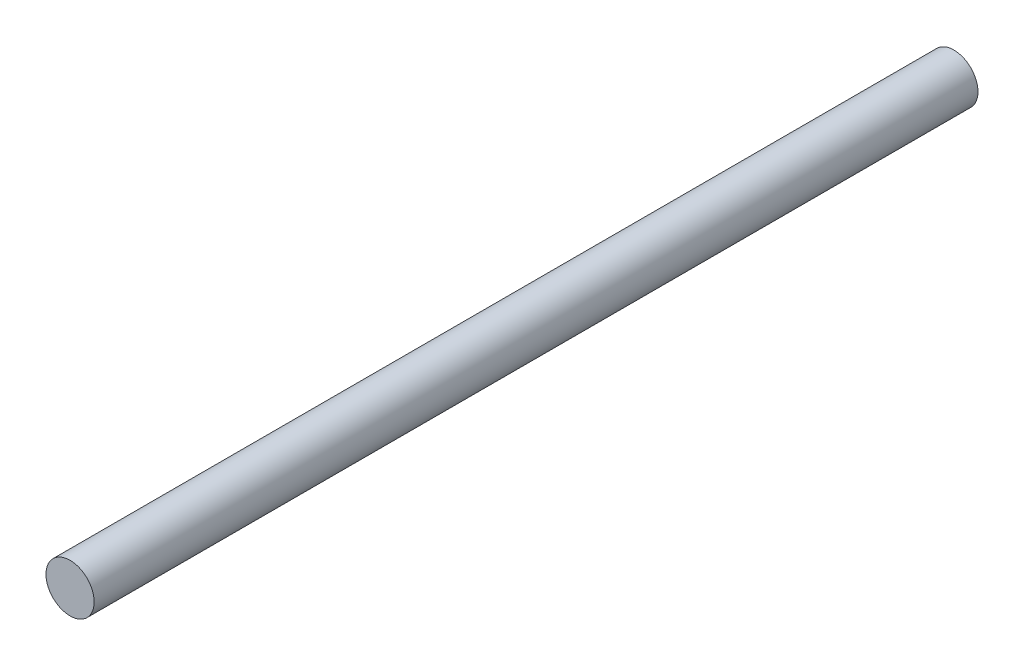
ISO-10303-21;
HEADER;
FILE_DESCRIPTION(('STEP AP214'),'2;1');
FILE_NAME('part.step','',(''),(''),'','','');
FILE_SCHEMA(('AUTOMOTIVE_DESIGN { 1 0 10303 214 1 1 1 1 }'));
ENDSEC;
DATA;
#1=APPLICATION_CONTEXT('core data for automotive mechanical design processes');
#2=APPLICATION_PROTOCOL_DEFINITION('international standard','automotive_design',2000,#1);
#3=PRODUCT_CONTEXT('',#1,'mechanical');
#4=PRODUCT('Part','Part','',(#3));
#5=PRODUCT_RELATED_PRODUCT_CATEGORY('part','',(#4));
#6=PRODUCT_DEFINITION_FORMATION('','',#4);
#7=PRODUCT_DEFINITION_CONTEXT('part definition',#1,'design');
#8=PRODUCT_DEFINITION('design','',#6,#7);
#9=PRODUCT_DEFINITION_SHAPE('','',#8);
#10=(LENGTH_UNIT() NAMED_UNIT(*) SI_UNIT(.MILLI.,.METRE.));
#11=(NAMED_UNIT(*) PLANE_ANGLE_UNIT() SI_UNIT($,.RADIAN.));
#12=(NAMED_UNIT(*) SI_UNIT($,.STERADIAN.) SOLID_ANGLE_UNIT());
#13=UNCERTAINTY_MEASURE_WITH_UNIT(LENGTH_MEASURE(1.E-05),#10,'distance_accuracy_value','');
#14=(GEOMETRIC_REPRESENTATION_CONTEXT(3) GLOBAL_UNCERTAINTY_ASSIGNED_CONTEXT((#13)) GLOBAL_UNIT_ASSIGNED_CONTEXT((#10,
#11,#12)) REPRESENTATION_CONTEXT('',''));
#15=CARTESIAN_POINT('',(0.,0.,0.));
#16=DIRECTION('',(0.,0.,1.));
#17=DIRECTION('',(1.,0.,0.));
#18=AXIS2_PLACEMENT_3D('',#15,#16,#17);
#19=CARTESIAN_POINT('',(0.,0.,55.));
#20=DIRECTION('',(0.,0.,-1.));
#21=DIRECTION('',(-1.,0.,0.));
#22=AXIS2_PLACEMENT_3D('',#19,#20,#21);
#23=CYLINDRICAL_SURFACE('',#22,1.5);
#24=CARTESIAN_POINT('',(0.,0.,55.));
#25=DIRECTION('',(0.,0.,1.));
#26=DIRECTION('',(1.,0.,0.));
#27=AXIS2_PLACEMENT_3D('',#24,#25,#26);
#28=CIRCLE('',#27,1.5);
#29=CARTESIAN_POINT('',(1.5,0.,55.));
#30=VERTEX_POINT('',#29);
#31=EDGE_CURVE('E10',#30,#30,#28,.T.);
#32=ORIENTED_EDGE('',*,*,#31,.F.);
#33=EDGE_LOOP('',(#32));
#34=FACE_BOUND('',#33,.T.);
#35=CARTESIAN_POINT('',(0.,0.,0.));
#36=DIRECTION('',(0.,0.,1.));
#37=DIRECTION('',(1.,0.,0.));
#38=AXIS2_PLACEMENT_3D('',#35,#36,#37);
#39=CIRCLE('',#38,1.5);
#40=CARTESIAN_POINT('',(1.5,0.,0.));
#41=VERTEX_POINT('',#40);
#42=EDGE_CURVE('E35',#41,#41,#39,.T.);
#43=ORIENTED_EDGE('',*,*,#42,.T.);
#44=EDGE_LOOP('',(#43));
#45=FACE_BOUND('',#44,.T.);
#46=ADVANCED_FACE('F32',(#34,#45),#23,.T.);
#47=CARTESIAN_POINT('',(0.,0.,55.));
#48=DIRECTION('',(0.,0.,1.));
#49=DIRECTION('',(1.,0.,0.));
#50=AXIS2_PLACEMENT_3D('',#47,#48,#49);
#51=PLANE('',#50);
#52=ORIENTED_EDGE('',*,*,#31,.T.);
#53=EDGE_LOOP('',(#52));
#54=FACE_BOUND('',#53,.T.);
#55=ADVANCED_FACE('F47',(#54),#51,.T.);
#56=CARTESIAN_POINT('',(0.,0.,0.));
#57=DIRECTION('',(0.,0.,1.));
#58=DIRECTION('',(1.,0.,0.));
#59=AXIS2_PLACEMENT_3D('',#56,#57,#58);
#60=PLANE('',#59);
#61=ORIENTED_EDGE('',*,*,#42,.F.);
#62=EDGE_LOOP('',(#61));
#63=FACE_BOUND('',#62,.T.);
#64=ADVANCED_FACE('F45',(#63),#60,.F.);
#65=CLOSED_SHELL('',(#46,#55,#64));
#66=MANIFOLD_SOLID_BREP('B2',#65);
#67=ADVANCED_BREP_SHAPE_REPRESENTATION('',(#18,#66),#14);
#68=SHAPE_DEFINITION_REPRESENTATION(#9,#67);
ENDSEC;
END-ISO-10303-21;
